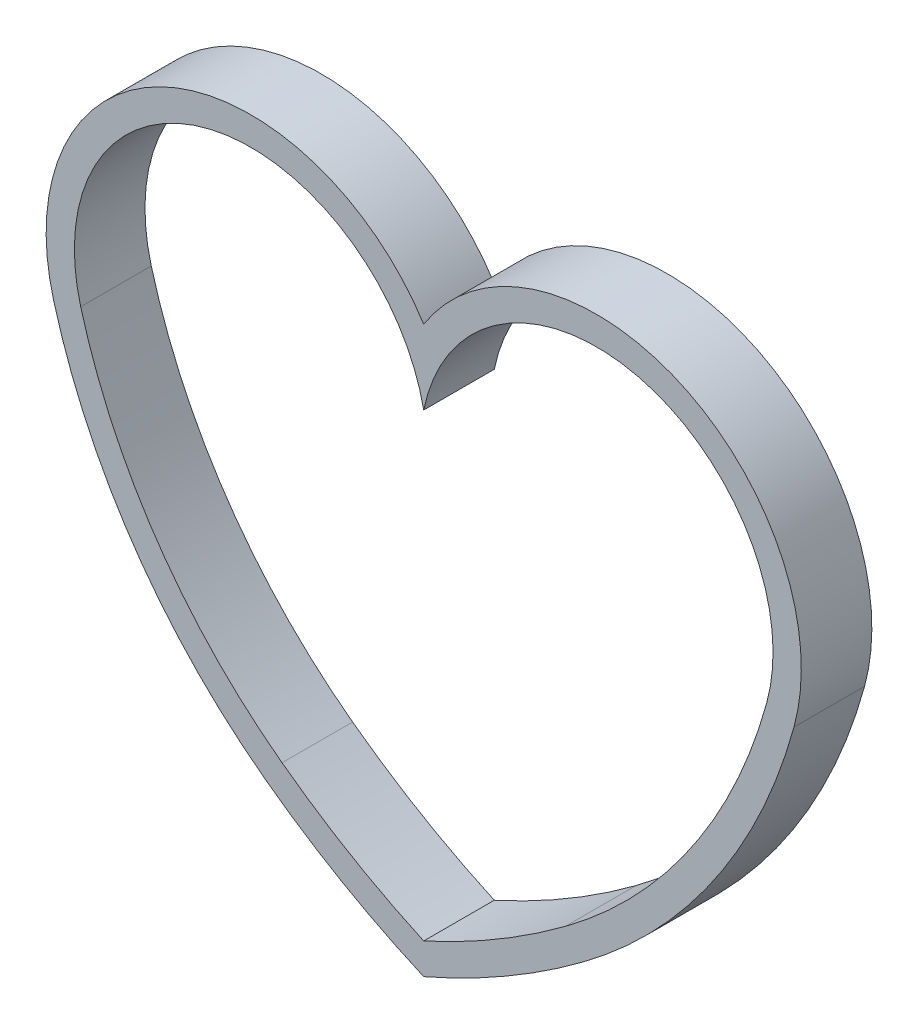
ISO-10303-21;
HEADER;
FILE_DESCRIPTION(('STEP AP214'),'2;1');
FILE_NAME('part.step','',(''),(''),'','','');
FILE_SCHEMA(('AUTOMOTIVE_DESIGN { 1 0 10303 214 1 1 1 1 }'));
ENDSEC;
DATA;
#1=APPLICATION_CONTEXT('core data for automotive mechanical design processes');
#2=APPLICATION_PROTOCOL_DEFINITION('international standard','automotive_design',2000,#1);
#3=PRODUCT_CONTEXT('',#1,'mechanical');
#4=PRODUCT('Part','Part','',(#3));
#5=PRODUCT_RELATED_PRODUCT_CATEGORY('part','',(#4));
#6=PRODUCT_DEFINITION_FORMATION('','',#4);
#7=PRODUCT_DEFINITION_CONTEXT('part definition',#1,'design');
#8=PRODUCT_DEFINITION('design','',#6,#7);
#9=PRODUCT_DEFINITION_SHAPE('','',#8);
#10=(LENGTH_UNIT() NAMED_UNIT(*) SI_UNIT(.MILLI.,.METRE.));
#11=(NAMED_UNIT(*) PLANE_ANGLE_UNIT() SI_UNIT($,.RADIAN.));
#12=(NAMED_UNIT(*) SI_UNIT($,.STERADIAN.) SOLID_ANGLE_UNIT());
#13=UNCERTAINTY_MEASURE_WITH_UNIT(LENGTH_MEASURE(1.E-05),#10,'distance_accuracy_value','');
#14=(GEOMETRIC_REPRESENTATION_CONTEXT(3) GLOBAL_UNCERTAINTY_ASSIGNED_CONTEXT((#13)) GLOBAL_UNIT_ASSIGNED_CONTEXT((#10,
#11,#12)) REPRESENTATION_CONTEXT('',''));
#15=CARTESIAN_POINT('',(0.,0.,0.));
#16=DIRECTION('',(0.,0.,1.));
#17=DIRECTION('',(1.,0.,0.));
#18=AXIS2_PLACEMENT_3D('',#15,#16,#17);
#19=CARTESIAN_POINT('',(0.207612080189582,0.496196952997061,2.54));
#20=DIRECTION('',(0.,0.,-1.));
#21=DIRECTION('',(-1.,0.,0.));
#22=AXIS2_PLACEMENT_3D('',#19,#20,#21);
#23=PLANE('',#22);
#24=CARTESIAN_POINT('',(6.63692810704844,2.26239390599407,2.54));
#25=DIRECTION('',(0.,0.,1.));
#26=DIRECTION('',(-1.,0.,0.));
#27=AXIS2_PLACEMENT_3D('',#24,#25,#26);
#28=CIRCLE('',#27,20.701);
#29=CARTESIAN_POINT('',(-13.3245673668181,-3.22122710997759,2.54));
#30=VERTEX_POINT('',#29);
#31=CARTESIAN_POINT('',(-5.70434843516716,-14.3576029143594,2.54));
#32=VERTEX_POINT('',#31);
#33=EDGE_CURVE('E181',#30,#32,#28,.T.);
#34=ORIENTED_EDGE('',*,*,#33,.T.);
#35=CARTESIAN_POINT('',(11.5582960533307,8.89000000000006,2.54));
#36=DIRECTION('',(0.,0.,1.));
#37=DIRECTION('',(-1.,0.,0.));
#38=AXIS2_PLACEMENT_3D('',#35,#36,#37);
#39=CIRCLE('',#38,28.956);
#40=CARTESIAN_POINT('',(0.,-17.6591191632333,2.54));
#41=VERTEX_POINT('',#40);
#42=EDGE_CURVE('E184',#32,#41,#39,.T.);
#43=ORIENTED_EDGE('',*,*,#42,.T.);
#44=CARTESIAN_POINT('',(-11.5582960533307,8.89,2.54));
#45=DIRECTION('',(0.,0.,1.));
#46=DIRECTION('',(1.,0.,0.));
#47=AXIS2_PLACEMENT_3D('',#44,#45,#46);
#48=CIRCLE('',#47,28.956);
#49=CARTESIAN_POINT('',(5.70434843516715,-14.3576029143595,2.54));
#50=VERTEX_POINT('',#49);
#51=EDGE_CURVE('E187',#41,#50,#48,.T.);
#52=ORIENTED_EDGE('',*,*,#51,.T.);
#53=CARTESIAN_POINT('',(-6.63692810704844,2.26239390599401,2.54));
#54=DIRECTION('',(0.,0.,1.));
#55=DIRECTION('',(1.,0.,0.));
#56=AXIS2_PLACEMENT_3D('',#53,#54,#55);
#57=CIRCLE('',#56,20.701);
#58=CARTESIAN_POINT('',(13.3245673668181,-3.22122710997765,2.54));
#59=VERTEX_POINT('',#58);
#60=EDGE_CURVE('E189',#50,#59,#57,.T.);
#61=ORIENTED_EDGE('',*,*,#60,.T.);
#62=CARTESIAN_POINT('',(6.22170394666927,-1.27,2.54));
#63=DIRECTION('',(0.,0.,1.));
#64=DIRECTION('',(1.,0.,0.));
#65=AXIS2_PLACEMENT_3D('',#62,#63,#64);
#66=CIRCLE('',#65,7.366);
#67=CARTESIAN_POINT('',(0.,2.67314037285008,2.54));
#68=VERTEX_POINT('',#67);
#69=EDGE_CURVE('E191',#59,#68,#66,.T.);
#70=ORIENTED_EDGE('',*,*,#69,.T.);
#71=CARTESIAN_POINT('',(-6.22170394666927,-1.26999999999994,2.54));
#72=DIRECTION('',(0.,0.,1.));
#73=DIRECTION('',(-1.,0.,0.));
#74=AXIS2_PLACEMENT_3D('',#71,#72,#73);
#75=CIRCLE('',#74,7.366);
#76=EDGE_CURVE('E193',#68,#30,#75,.T.);
#77=ORIENTED_EDGE('',*,*,#76,.T.);
#78=EDGE_LOOP('',(#34,#43,#52,#61,#70,#77));
#79=FACE_BOUND('',#78,.T.);
#80=CARTESIAN_POINT('',(-6.22170394666927,-1.26999999999994,2.54));
#81=DIRECTION('',(0.,0.,1.));
#82=DIRECTION('',(-1.,0.,0.));
#83=AXIS2_PLACEMENT_3D('',#80,#81,#82);
#84=CIRCLE('',#83,6.35);
#85=CARTESIAN_POINT('',(0.,0.,2.54));
#86=VERTEX_POINT('',#85);
#87=CARTESIAN_POINT('',(-12.3448620674872,-2.95209233618758,2.54));
#88=VERTEX_POINT('',#87);
#89=EDGE_CURVE('E130',#86,#88,#84,.T.);
#90=ORIENTED_EDGE('',*,*,#89,.F.);
#91=CARTESIAN_POINT('',(6.22170394666927,-1.27,2.54));
#92=DIRECTION('',(0.,0.,1.));
#93=DIRECTION('',(1.,0.,0.));
#94=AXIS2_PLACEMENT_3D('',#91,#92,#93);
#95=CIRCLE('',#94,6.35);
#96=CARTESIAN_POINT('',(12.3448620674872,-2.95209233618762,2.54));
#97=VERTEX_POINT('',#96);
#98=EDGE_CURVE('E159',#97,#86,#95,.T.);
#99=ORIENTED_EDGE('',*,*,#98,.F.);
#100=CARTESIAN_POINT('',(-6.63692810704844,2.26239390599401,2.54));
#101=DIRECTION('',(0.,0.,1.));
#102=DIRECTION('',(1.,0.,0.));
#103=AXIS2_PLACEMENT_3D('',#100,#101,#102);
#104=CIRCLE('',#103,19.685);
#105=CARTESIAN_POINT('',(5.09864161100932,-13.5418975489433,2.54));
#106=VERTEX_POINT('',#105);
#107=EDGE_CURVE('E157',#106,#97,#104,.T.);
#108=ORIENTED_EDGE('',*,*,#107,.F.);
#109=CARTESIAN_POINT('',(-11.5582960533307,8.89,2.54));
#110=DIRECTION('',(0.,0.,1.));
#111=DIRECTION('',(1.,0.,0.));
#112=AXIS2_PLACEMENT_3D('',#109,#110,#111);
#113=CIRCLE('',#112,27.94);
#114=CARTESIAN_POINT('',(0.,-16.5471655721222,2.54));
#115=VERTEX_POINT('',#114);
#116=EDGE_CURVE('E153',#115,#106,#113,.T.);
#117=ORIENTED_EDGE('',*,*,#116,.F.);
#118=CARTESIAN_POINT('',(11.5582960533307,8.89000000000006,2.54));
#119=DIRECTION('',(0.,0.,1.));
#120=DIRECTION('',(-1.,0.,0.));
#121=AXIS2_PLACEMENT_3D('',#118,#119,#120);
#122=CIRCLE('',#121,27.94);
#123=CARTESIAN_POINT('',(-5.09864161100934,-13.5418975489433,2.54));
#124=VERTEX_POINT('',#123);
#125=EDGE_CURVE('E151',#124,#115,#122,.T.);
#126=ORIENTED_EDGE('',*,*,#125,.F.);
#127=CARTESIAN_POINT('',(6.63692810704844,2.26239390599407,2.54));
#128=DIRECTION('',(0.,0.,1.));
#129=DIRECTION('',(-1.,0.,0.));
#130=AXIS2_PLACEMENT_3D('',#127,#128,#129);
#131=CIRCLE('',#130,19.685);
#132=EDGE_CURVE('E138',#88,#124,#131,.T.);
#133=ORIENTED_EDGE('',*,*,#132,.F.);
#134=EDGE_LOOP('',(#90,#99,#108,#117,#126,#133));
#135=FACE_BOUND('',#134,.T.);
#136=ADVANCED_FACE('F41',(#79,#135),#23,.F.);
#137=CARTESIAN_POINT('',(0.207612080189582,0.496196952997061,0.));
#138=DIRECTION('',(0.,0.,-1.));
#139=DIRECTION('',(-1.,0.,0.));
#140=AXIS2_PLACEMENT_3D('',#137,#138,#139);
#141=PLANE('',#140);
#142=CARTESIAN_POINT('',(6.63692810704844,2.26239390599407,0.));
#143=DIRECTION('',(0.,0.,1.));
#144=DIRECTION('',(-1.,0.,0.));
#145=AXIS2_PLACEMENT_3D('',#142,#143,#144);
#146=CIRCLE('',#145,20.701);
#147=CARTESIAN_POINT('',(-13.3245673668181,-3.22122710997759,0.));
#148=VERTEX_POINT('',#147);
#149=CARTESIAN_POINT('',(-5.70434843516716,-14.3576029143594,0.));
#150=VERTEX_POINT('',#149);
#151=EDGE_CURVE('E146',#148,#150,#146,.T.);
#152=ORIENTED_EDGE('',*,*,#151,.F.);
#153=CARTESIAN_POINT('',(-6.22170394666927,-1.26999999999994,0.));
#154=DIRECTION('',(0.,0.,1.));
#155=DIRECTION('',(-1.,0.,0.));
#156=AXIS2_PLACEMENT_3D('',#153,#154,#155);
#157=CIRCLE('',#156,7.366);
#158=CARTESIAN_POINT('',(0.,2.67314037285008,0.));
#159=VERTEX_POINT('',#158);
#160=EDGE_CURVE('E185',#159,#148,#157,.T.);
#161=ORIENTED_EDGE('',*,*,#160,.F.);
#162=CARTESIAN_POINT('',(6.22170394666927,-1.27,0.));
#163=DIRECTION('',(0.,0.,1.));
#164=DIRECTION('',(1.,0.,0.));
#165=AXIS2_PLACEMENT_3D('',#162,#163,#164);
#166=CIRCLE('',#165,7.366);
#167=CARTESIAN_POINT('',(13.3245673668181,-3.22122710997765,0.));
#168=VERTEX_POINT('',#167);
#169=EDGE_CURVE('E204',#168,#159,#166,.T.);
#170=ORIENTED_EDGE('',*,*,#169,.F.);
#171=CARTESIAN_POINT('',(-6.63692810704844,2.26239390599401,0.));
#172=DIRECTION('',(0.,0.,1.));
#173=DIRECTION('',(1.,0.,0.));
#174=AXIS2_PLACEMENT_3D('',#171,#172,#173);
#175=CIRCLE('',#174,20.701);
#176=CARTESIAN_POINT('',(5.70434843516715,-14.3576029143595,0.));
#177=VERTEX_POINT('',#176);
#178=EDGE_CURVE('E202',#177,#168,#175,.T.);
#179=ORIENTED_EDGE('',*,*,#178,.F.);
#180=CARTESIAN_POINT('',(-11.5582960533307,8.89,0.));
#181=DIRECTION('',(0.,0.,1.));
#182=DIRECTION('',(1.,0.,0.));
#183=AXIS2_PLACEMENT_3D('',#180,#181,#182);
#184=CIRCLE('',#183,28.956);
#185=CARTESIAN_POINT('',(0.,-17.6591191632333,0.));
#186=VERTEX_POINT('',#185);
#187=EDGE_CURVE('E200',#186,#177,#184,.T.);
#188=ORIENTED_EDGE('',*,*,#187,.F.);
#189=CARTESIAN_POINT('',(11.5582960533307,8.89000000000006,0.));
#190=DIRECTION('',(0.,0.,1.));
#191=DIRECTION('',(-1.,0.,0.));
#192=AXIS2_PLACEMENT_3D('',#189,#190,#191);
#193=CIRCLE('',#192,28.956);
#194=EDGE_CURVE('E198',#150,#186,#193,.T.);
#195=ORIENTED_EDGE('',*,*,#194,.F.);
#196=EDGE_LOOP('',(#152,#161,#170,#179,#188,#195));
#197=FACE_BOUND('',#196,.T.);
#198=CARTESIAN_POINT('',(6.22170394666927,-1.27,0.));
#199=DIRECTION('',(0.,0.,1.));
#200=DIRECTION('',(1.,0.,0.));
#201=AXIS2_PLACEMENT_3D('',#198,#199,#200);
#202=CIRCLE('',#201,6.35);
#203=CARTESIAN_POINT('',(12.3448620674872,-2.95209233618762,0.));
#204=VERTEX_POINT('',#203);
#205=CARTESIAN_POINT('',(0.,0.,0.));
#206=VERTEX_POINT('',#205);
#207=EDGE_CURVE('E139',#204,#206,#202,.T.);
#208=ORIENTED_EDGE('',*,*,#207,.T.);
#209=CARTESIAN_POINT('',(-6.22170394666927,-1.26999999999994,0.));
#210=DIRECTION('',(0.,0.,1.));
#211=DIRECTION('',(-1.,0.,0.));
#212=AXIS2_PLACEMENT_3D('',#209,#210,#211);
#213=CIRCLE('',#212,6.35);
#214=CARTESIAN_POINT('',(-12.3448620674872,-2.95209233618758,0.));
#215=VERTEX_POINT('',#214);
#216=EDGE_CURVE('E64',#206,#215,#213,.T.);
#217=ORIENTED_EDGE('',*,*,#216,.T.);
#218=CARTESIAN_POINT('',(6.63692810704844,2.26239390599407,0.));
#219=DIRECTION('',(0.,0.,1.));
#220=DIRECTION('',(-1.,0.,0.));
#221=AXIS2_PLACEMENT_3D('',#218,#219,#220);
#222=CIRCLE('',#221,19.685);
#223=CARTESIAN_POINT('',(-5.09864161100934,-13.5418975489433,0.));
#224=VERTEX_POINT('',#223);
#225=EDGE_CURVE('E145',#215,#224,#222,.T.);
#226=ORIENTED_EDGE('',*,*,#225,.T.);
#227=CARTESIAN_POINT('',(11.5582960533307,8.89000000000006,0.));
#228=DIRECTION('',(0.,0.,1.));
#229=DIRECTION('',(-1.,0.,0.));
#230=AXIS2_PLACEMENT_3D('',#227,#228,#229);
#231=CIRCLE('',#230,27.94);
#232=CARTESIAN_POINT('',(0.,-16.5471655721222,0.));
#233=VERTEX_POINT('',#232);
#234=EDGE_CURVE('E163',#224,#233,#231,.T.);
#235=ORIENTED_EDGE('',*,*,#234,.T.);
#236=CARTESIAN_POINT('',(-11.5582960533307,8.89,0.));
#237=DIRECTION('',(0.,0.,1.));
#238=DIRECTION('',(1.,0.,0.));
#239=AXIS2_PLACEMENT_3D('',#236,#237,#238);
#240=CIRCLE('',#239,27.94);
#241=CARTESIAN_POINT('',(5.09864161100932,-13.5418975489433,0.));
#242=VERTEX_POINT('',#241);
#243=EDGE_CURVE('E166',#233,#242,#240,.T.);
#244=ORIENTED_EDGE('',*,*,#243,.T.);
#245=CARTESIAN_POINT('',(-6.63692810704844,2.26239390599401,0.));
#246=DIRECTION('',(0.,0.,1.));
#247=DIRECTION('',(1.,0.,0.));
#248=AXIS2_PLACEMENT_3D('',#245,#246,#247);
#249=CIRCLE('',#248,19.685);
#250=EDGE_CURVE('E169',#242,#204,#249,.T.);
#251=ORIENTED_EDGE('',*,*,#250,.T.);
#252=EDGE_LOOP('',(#208,#217,#226,#235,#244,#251));
#253=FACE_BOUND('',#252,.T.);
#254=ADVANCED_FACE('F228',(#197,#253),#141,.T.);
#255=CARTESIAN_POINT('',(6.63692810704844,2.26239390599407,2.54));
#256=DIRECTION('',(0.,0.,-1.));
#257=DIRECTION('',(-1.,0.,0.));
#258=AXIS2_PLACEMENT_3D('',#255,#256,#257);
#259=CYLINDRICAL_SURFACE('',#258,20.701);
#260=ORIENTED_EDGE('',*,*,#151,.T.);
#261=DIRECTION('',(0.,0.,-1.));
#262=VECTOR('',#261,1.);
#263=CARTESIAN_POINT('',(-5.70434843516716,-14.3576029143594,2.54));
#264=LINE('',#263,#262);
#265=EDGE_CURVE('E11',#32,#150,#264,.T.);
#266=ORIENTED_EDGE('',*,*,#265,.F.);
#267=ORIENTED_EDGE('',*,*,#33,.F.);
#268=DIRECTION('',(0.,0.,-1.));
#269=VECTOR('',#268,1.);
#270=CARTESIAN_POINT('',(-13.3245673668181,-3.22122710997759,2.54));
#271=LINE('',#270,#269);
#272=EDGE_CURVE('E195',#30,#148,#271,.T.);
#273=ORIENTED_EDGE('',*,*,#272,.T.);
#274=EDGE_LOOP('',(#260,#266,#267,#273));
#275=FACE_BOUND('',#274,.T.);
#276=ADVANCED_FACE('F43',(#275),#259,.T.);
#277=CARTESIAN_POINT('',(11.5582960533307,8.89000000000006,2.54));
#278=DIRECTION('',(0.,0.,-1.));
#279=DIRECTION('',(-1.,0.,0.));
#280=AXIS2_PLACEMENT_3D('',#277,#278,#279);
#281=CYLINDRICAL_SURFACE('',#280,28.956);
#282=ORIENTED_EDGE('',*,*,#194,.T.);
#283=DIRECTION('',(0.,0.,-1.));
#284=VECTOR('',#283,1.);
#285=CARTESIAN_POINT('',(0.,-17.6591191632333,2.54));
#286=LINE('',#285,#284);
#287=EDGE_CURVE('E49',#41,#186,#286,.T.);
#288=ORIENTED_EDGE('',*,*,#287,.F.);
#289=ORIENTED_EDGE('',*,*,#42,.F.);
#290=ORIENTED_EDGE('',*,*,#265,.T.);
#291=EDGE_LOOP('',(#282,#288,#289,#290));
#292=FACE_BOUND('',#291,.T.);
#293=ADVANCED_FACE('F245',(#292),#281,.T.);
#294=CARTESIAN_POINT('',(-11.5582960533307,8.89,2.54));
#295=DIRECTION('',(0.,0.,-1.));
#296=DIRECTION('',(-1.,0.,0.));
#297=AXIS2_PLACEMENT_3D('',#294,#295,#296);
#298=CYLINDRICAL_SURFACE('',#297,28.956);
#299=ORIENTED_EDGE('',*,*,#187,.T.);
#300=DIRECTION('',(0.,0.,-1.));
#301=VECTOR('',#300,1.);
#302=CARTESIAN_POINT('',(5.70434843516715,-14.3576029143595,2.54));
#303=LINE('',#302,#301);
#304=EDGE_CURVE('E215',#50,#177,#303,.T.);
#305=ORIENTED_EDGE('',*,*,#304,.F.);
#306=ORIENTED_EDGE('',*,*,#51,.F.);
#307=ORIENTED_EDGE('',*,*,#287,.T.);
#308=EDGE_LOOP('',(#299,#305,#306,#307));
#309=FACE_BOUND('',#308,.T.);
#310=ADVANCED_FACE('F222',(#309),#298,.T.);
#311=CARTESIAN_POINT('',(-6.63692810704844,2.26239390599401,2.54));
#312=DIRECTION('',(0.,0.,-1.));
#313=DIRECTION('',(-1.,0.,0.));
#314=AXIS2_PLACEMENT_3D('',#311,#312,#313);
#315=CYLINDRICAL_SURFACE('',#314,20.701);
#316=ORIENTED_EDGE('',*,*,#178,.T.);
#317=DIRECTION('',(0.,0.,-1.));
#318=VECTOR('',#317,1.);
#319=CARTESIAN_POINT('',(13.3245673668181,-3.22122710997765,2.54));
#320=LINE('',#319,#318);
#321=EDGE_CURVE('E212',#59,#168,#320,.T.);
#322=ORIENTED_EDGE('',*,*,#321,.F.);
#323=ORIENTED_EDGE('',*,*,#60,.F.);
#324=ORIENTED_EDGE('',*,*,#304,.T.);
#325=EDGE_LOOP('',(#316,#322,#323,#324));
#326=FACE_BOUND('',#325,.T.);
#327=ADVANCED_FACE('F234',(#326),#315,.T.);
#328=CARTESIAN_POINT('',(6.22170394666927,-1.27,2.54));
#329=DIRECTION('',(0.,0.,-1.));
#330=DIRECTION('',(-1.,0.,0.));
#331=AXIS2_PLACEMENT_3D('',#328,#329,#330);
#332=CYLINDRICAL_SURFACE('',#331,7.366);
#333=ORIENTED_EDGE('',*,*,#169,.T.);
#334=DIRECTION('',(0.,0.,-1.));
#335=VECTOR('',#334,1.);
#336=CARTESIAN_POINT('',(0.,2.67314037285008,2.54));
#337=LINE('',#336,#335);
#338=EDGE_CURVE('E209',#68,#159,#337,.T.);
#339=ORIENTED_EDGE('',*,*,#338,.F.);
#340=ORIENTED_EDGE('',*,*,#69,.F.);
#341=ORIENTED_EDGE('',*,*,#321,.T.);
#342=EDGE_LOOP('',(#333,#339,#340,#341));
#343=FACE_BOUND('',#342,.T.);
#344=ADVANCED_FACE('F238',(#343),#332,.T.);
#345=CARTESIAN_POINT('',(-6.22170394666927,-1.26999999999994,2.54));
#346=DIRECTION('',(0.,0.,-1.));
#347=DIRECTION('',(-1.,0.,0.));
#348=AXIS2_PLACEMENT_3D('',#345,#346,#347);
#349=CYLINDRICAL_SURFACE('',#348,7.366);
#350=ORIENTED_EDGE('',*,*,#160,.T.);
#351=ORIENTED_EDGE('',*,*,#272,.F.);
#352=ORIENTED_EDGE('',*,*,#76,.F.);
#353=ORIENTED_EDGE('',*,*,#338,.T.);
#354=EDGE_LOOP('',(#350,#351,#352,#353));
#355=FACE_BOUND('',#354,.T.);
#356=ADVANCED_FACE('F248',(#355),#349,.T.);
#357=CARTESIAN_POINT('',(-6.22170394666927,-1.26999999999994,2.54));
#358=DIRECTION('',(0.,0.,-1.));
#359=DIRECTION('',(-1.,0.,0.));
#360=AXIS2_PLACEMENT_3D('',#357,#358,#359);
#361=CYLINDRICAL_SURFACE('',#360,6.35);
#362=ORIENTED_EDGE('',*,*,#216,.F.);
#363=DIRECTION('',(0.,0.,-1.));
#364=VECTOR('',#363,1.);
#365=CARTESIAN_POINT('',(0.,0.,2.54));
#366=LINE('',#365,#364);
#367=EDGE_CURVE('E134',#86,#206,#366,.T.);
#368=ORIENTED_EDGE('',*,*,#367,.F.);
#369=ORIENTED_EDGE('',*,*,#89,.T.);
#370=DIRECTION('',(0.,0.,-1.));
#371=VECTOR('',#370,1.);
#372=CARTESIAN_POINT('',(-12.3448620674872,-2.95209233618758,2.54));
#373=LINE('',#372,#371);
#374=EDGE_CURVE('E133',#88,#215,#373,.T.);
#375=ORIENTED_EDGE('',*,*,#374,.T.);
#376=EDGE_LOOP('',(#362,#368,#369,#375));
#377=FACE_BOUND('',#376,.T.);
#378=ADVANCED_FACE('F132',(#377),#361,.F.);
#379=CARTESIAN_POINT('',(6.63692810704844,2.26239390599407,2.54));
#380=DIRECTION('',(0.,0.,-1.));
#381=DIRECTION('',(-1.,0.,0.));
#382=AXIS2_PLACEMENT_3D('',#379,#380,#381);
#383=CYLINDRICAL_SURFACE('',#382,19.685);
#384=ORIENTED_EDGE('',*,*,#225,.F.);
#385=ORIENTED_EDGE('',*,*,#374,.F.);
#386=ORIENTED_EDGE('',*,*,#132,.T.);
#387=DIRECTION('',(0.,0.,-1.));
#388=VECTOR('',#387,1.);
#389=CARTESIAN_POINT('',(-5.09864161100934,-13.5418975489433,2.54));
#390=LINE('',#389,#388);
#391=EDGE_CURVE('E147',#124,#224,#390,.T.);
#392=ORIENTED_EDGE('',*,*,#391,.T.);
#393=EDGE_LOOP('',(#384,#385,#386,#392));
#394=FACE_BOUND('',#393,.T.);
#395=ADVANCED_FACE('F142',(#394),#383,.F.);
#396=CARTESIAN_POINT('',(11.5582960533307,8.89000000000006,2.54));
#397=DIRECTION('',(0.,0.,-1.));
#398=DIRECTION('',(-1.,0.,0.));
#399=AXIS2_PLACEMENT_3D('',#396,#397,#398);
#400=CYLINDRICAL_SURFACE('',#399,27.94);
#401=ORIENTED_EDGE('',*,*,#234,.F.);
#402=ORIENTED_EDGE('',*,*,#391,.F.);
#403=ORIENTED_EDGE('',*,*,#125,.T.);
#404=DIRECTION('',(0.,0.,-1.));
#405=VECTOR('',#404,1.);
#406=CARTESIAN_POINT('',(0.,-16.5471655721222,2.54));
#407=LINE('',#406,#405);
#408=EDGE_CURVE('E178',#115,#233,#407,.T.);
#409=ORIENTED_EDGE('',*,*,#408,.T.);
#410=EDGE_LOOP('',(#401,#402,#403,#409));
#411=FACE_BOUND('',#410,.T.);
#412=ADVANCED_FACE('F266',(#411),#400,.F.);
#413=CARTESIAN_POINT('',(-11.5582960533307,8.89,2.54));
#414=DIRECTION('',(0.,0.,-1.));
#415=DIRECTION('',(-1.,0.,0.));
#416=AXIS2_PLACEMENT_3D('',#413,#414,#415);
#417=CYLINDRICAL_SURFACE('',#416,27.94);
#418=ORIENTED_EDGE('',*,*,#243,.F.);
#419=ORIENTED_EDGE('',*,*,#408,.F.);
#420=ORIENTED_EDGE('',*,*,#116,.T.);
#421=DIRECTION('',(0.,0.,-1.));
#422=VECTOR('',#421,1.);
#423=CARTESIAN_POINT('',(5.09864161100932,-13.5418975489433,2.54));
#424=LINE('',#423,#422);
#425=EDGE_CURVE('E176',#106,#242,#424,.T.);
#426=ORIENTED_EDGE('',*,*,#425,.T.);
#427=EDGE_LOOP('',(#418,#419,#420,#426));
#428=FACE_BOUND('',#427,.T.);
#429=ADVANCED_FACE('F269',(#428),#417,.F.);
#430=CARTESIAN_POINT('',(-6.63692810704844,2.26239390599401,2.54));
#431=DIRECTION('',(0.,0.,-1.));
#432=DIRECTION('',(-1.,0.,0.));
#433=AXIS2_PLACEMENT_3D('',#430,#431,#432);
#434=CYLINDRICAL_SURFACE('',#433,19.685);
#435=ORIENTED_EDGE('',*,*,#250,.F.);
#436=ORIENTED_EDGE('',*,*,#425,.F.);
#437=ORIENTED_EDGE('',*,*,#107,.T.);
#438=DIRECTION('',(0.,0.,-1.));
#439=VECTOR('',#438,1.);
#440=CARTESIAN_POINT('',(12.3448620674872,-2.95209233618762,2.54));
#441=LINE('',#440,#439);
#442=EDGE_CURVE('E56',#97,#204,#441,.T.);
#443=ORIENTED_EDGE('',*,*,#442,.T.);
#444=EDGE_LOOP('',(#435,#436,#437,#443));
#445=FACE_BOUND('',#444,.T.);
#446=ADVANCED_FACE('F273',(#445),#434,.F.);
#447=CARTESIAN_POINT('',(6.22170394666927,-1.27,2.54));
#448=DIRECTION('',(0.,0.,-1.));
#449=DIRECTION('',(-1.,0.,0.));
#450=AXIS2_PLACEMENT_3D('',#447,#448,#449);
#451=CYLINDRICAL_SURFACE('',#450,6.35);
#452=ORIENTED_EDGE('',*,*,#207,.F.);
#453=ORIENTED_EDGE('',*,*,#442,.F.);
#454=ORIENTED_EDGE('',*,*,#98,.T.);
#455=ORIENTED_EDGE('',*,*,#367,.T.);
#456=EDGE_LOOP('',(#452,#453,#454,#455));
#457=FACE_BOUND('',#456,.T.);
#458=ADVANCED_FACE('F277',(#457),#451,.F.);
#459=CLOSED_SHELL('',(#136,#254,#276,#293,#310,#327,#344,#356,#378,#395,#412,#429,#446,#458));
#460=MANIFOLD_SOLID_BREP('B2',#459);
#461=ADVANCED_BREP_SHAPE_REPRESENTATION('',(#18,#460),#14);
#462=SHAPE_DEFINITION_REPRESENTATION(#9,#461);
ENDSEC;
END-ISO-10303-21;
